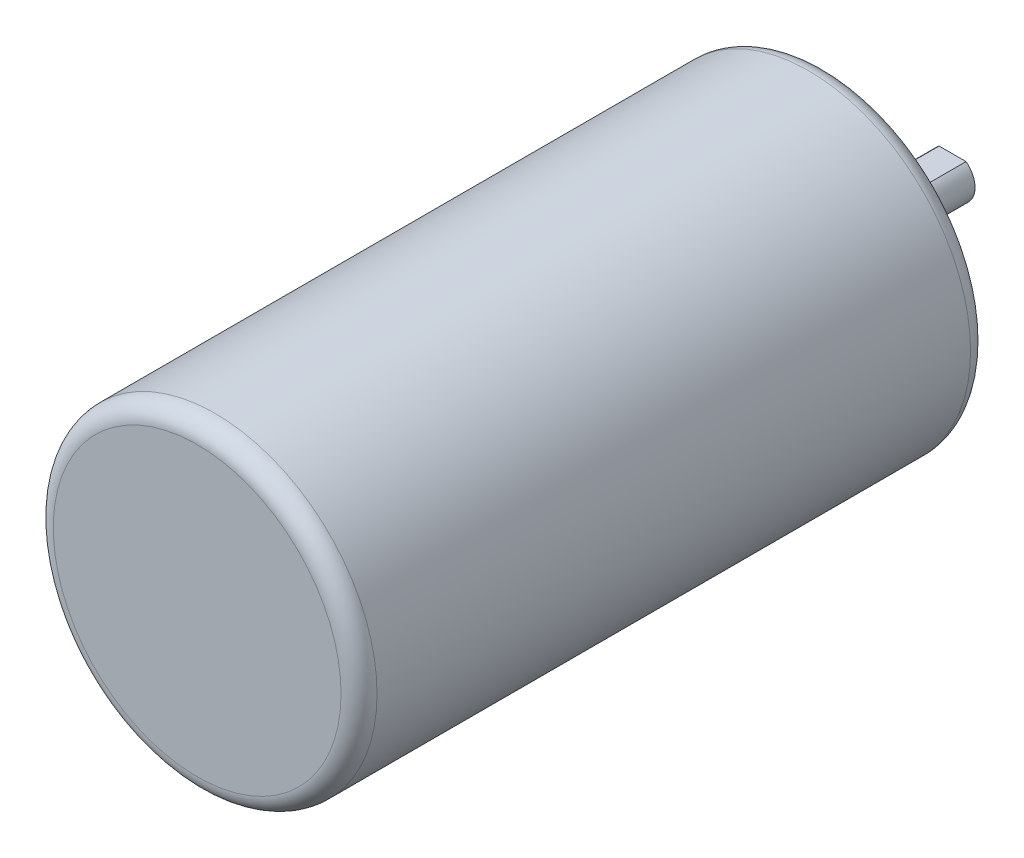
ISO-10303-21;
HEADER;
FILE_DESCRIPTION(('STEP AP214'),'2;1');
FILE_NAME('part.step','',(''),(''),'','','');
FILE_SCHEMA(('AUTOMOTIVE_DESIGN { 1 0 10303 214 1 1 1 1 }'));
ENDSEC;
DATA;
#1=APPLICATION_CONTEXT('core data for automotive mechanical design processes');
#2=APPLICATION_PROTOCOL_DEFINITION('international standard','automotive_design',2000,#1);
#3=PRODUCT_CONTEXT('',#1,'mechanical');
#4=PRODUCT('Part','Part','',(#3));
#5=PRODUCT_RELATED_PRODUCT_CATEGORY('part','',(#4));
#6=PRODUCT_DEFINITION_FORMATION('','',#4);
#7=PRODUCT_DEFINITION_CONTEXT('part definition',#1,'design');
#8=PRODUCT_DEFINITION('design','',#6,#7);
#9=PRODUCT_DEFINITION_SHAPE('','',#8);
#10=(LENGTH_UNIT() NAMED_UNIT(*) SI_UNIT(.MILLI.,.METRE.));
#11=(NAMED_UNIT(*) PLANE_ANGLE_UNIT() SI_UNIT($,.RADIAN.));
#12=(NAMED_UNIT(*) SI_UNIT($,.STERADIAN.) SOLID_ANGLE_UNIT());
#13=UNCERTAINTY_MEASURE_WITH_UNIT(LENGTH_MEASURE(1.E-05),#10,'distance_accuracy_value','');
#14=(GEOMETRIC_REPRESENTATION_CONTEXT(3) GLOBAL_UNCERTAINTY_ASSIGNED_CONTEXT((#13)) GLOBAL_UNIT_ASSIGNED_CONTEXT((#10,
#11,#12)) REPRESENTATION_CONTEXT('',''));
#15=CARTESIAN_POINT('',(0.,0.,0.));
#16=DIRECTION('',(0.,0.,1.));
#17=DIRECTION('',(1.,0.,0.));
#18=AXIS2_PLACEMENT_3D('',#15,#16,#17);
#19=CARTESIAN_POINT('',(0.,0.,0.));
#20=DIRECTION('',(0.,0.,1.));
#21=DIRECTION('',(1.,0.,0.));
#22=AXIS2_PLACEMENT_3D('',#19,#20,#21);
#23=PLANE('',#22);
#24=CARTESIAN_POINT('',(12.5,0.,0.));
#25=DIRECTION('',(0.,0.,-1.));
#26=DIRECTION('',(-1.,0.,0.));
#27=AXIS2_PLACEMENT_3D('',#24,#25,#26);
#28=CIRCLE('',#27,1.5);
#29=CARTESIAN_POINT('',(11.,0.,0.));
#30=VERTEX_POINT('',#29);
#31=EDGE_CURVE('E125',#30,#30,#28,.T.);
#32=ORIENTED_EDGE('',*,*,#31,.F.);
#33=EDGE_LOOP('',(#32));
#34=FACE_BOUND('',#33,.T.);
#35=CARTESIAN_POINT('',(6.25000000000013,-10.8253175473054,0.));
#36=DIRECTION('',(0.,0.,-1.));
#37=DIRECTION('',(-1.,0.,0.));
#38=AXIS2_PLACEMENT_3D('',#35,#36,#37);
#39=CIRCLE('',#38,1.5);
#40=CARTESIAN_POINT('',(4.75000000000013,-10.8253175473054,0.));
#41=VERTEX_POINT('',#40);
#42=EDGE_CURVE('E126',#41,#41,#39,.T.);
#43=ORIENTED_EDGE('',*,*,#42,.F.);
#44=EDGE_LOOP('',(#43));
#45=FACE_BOUND('',#44,.T.);
#46=CARTESIAN_POINT('',(-6.2499999999999,-10.8253175473055,0.));
#47=DIRECTION('',(0.,0.,-1.));
#48=DIRECTION('',(-1.,0.,0.));
#49=AXIS2_PLACEMENT_3D('',#46,#47,#48);
#50=CIRCLE('',#49,1.5);
#51=CARTESIAN_POINT('',(-7.7499999999999,-10.8253175473055,0.));
#52=VERTEX_POINT('',#51);
#53=EDGE_CURVE('E132',#52,#52,#50,.T.);
#54=ORIENTED_EDGE('',*,*,#53,.F.);
#55=EDGE_LOOP('',(#54));
#56=FACE_BOUND('',#55,.T.);
#57=CARTESIAN_POINT('',(-12.5,0.,0.));
#58=DIRECTION('',(0.,0.,-1.));
#59=DIRECTION('',(-1.,0.,0.));
#60=AXIS2_PLACEMENT_3D('',#57,#58,#59);
#61=CIRCLE('',#60,1.5);
#62=CARTESIAN_POINT('',(-14.,0.,0.));
#63=VERTEX_POINT('',#62);
#64=EDGE_CURVE('E138',#63,#63,#61,.T.);
#65=ORIENTED_EDGE('',*,*,#64,.F.);
#66=EDGE_LOOP('',(#65));
#67=FACE_BOUND('',#66,.T.);
#68=CARTESIAN_POINT('',(-6.25000000000005,10.8253175473055,0.));
#69=DIRECTION('',(0.,0.,-1.));
#70=DIRECTION('',(-1.,0.,0.));
#71=AXIS2_PLACEMENT_3D('',#68,#69,#70);
#72=CIRCLE('',#71,1.5);
#73=CARTESIAN_POINT('',(-7.75000000000005,10.8253175473055,0.));
#74=VERTEX_POINT('',#73);
#75=EDGE_CURVE('E136',#74,#74,#72,.T.);
#76=ORIENTED_EDGE('',*,*,#75,.F.);
#77=EDGE_LOOP('',(#76));
#78=FACE_BOUND('',#77,.T.);
#79=CARTESIAN_POINT('',(6.24999999999998,10.8253175473055,0.));
#80=DIRECTION('',(0.,0.,-1.));
#81=DIRECTION('',(-1.,0.,0.));
#82=AXIS2_PLACEMENT_3D('',#79,#80,#81);
#83=CIRCLE('',#82,1.5);
#84=CARTESIAN_POINT('',(4.74999999999998,10.8253175473055,0.));
#85=VERTEX_POINT('',#84);
#86=EDGE_CURVE('E145',#85,#85,#83,.T.);
#87=ORIENTED_EDGE('',*,*,#86,.F.);
#88=EDGE_LOOP('',(#87));
#89=FACE_BOUND('',#88,.T.);
#90=CARTESIAN_POINT('',(0.,0.,0.));
#91=DIRECTION('',(0.,0.,1.));
#92=DIRECTION('',(1.,0.,0.));
#93=AXIS2_PLACEMENT_3D('',#90,#91,#92);
#94=CIRCLE('',#93,16.);
#95=CARTESIAN_POINT('',(16.,0.,0.));
#96=VERTEX_POINT('',#95);
#97=EDGE_CURVE('E11',#96,#96,#94,.F.);
#98=ORIENTED_EDGE('',*,*,#97,.T.);
#99=EDGE_LOOP('',(#98));
#100=FACE_BOUND('',#99,.T.);
#101=CARTESIAN_POINT('',(0.,0.,0.));
#102=DIRECTION('',(0.,0.,-1.));
#103=DIRECTION('',(-1.,0.,0.));
#104=AXIS2_PLACEMENT_3D('',#101,#102,#103);
#105=CIRCLE('',#104,2.5);
#106=CARTESIAN_POINT('',(1.5,2.,0.));
#107=VERTEX_POINT('',#106);
#108=CARTESIAN_POINT('',(-1.5,2.,0.));
#109=VERTEX_POINT('',#108);
#110=EDGE_CURVE('E75',#107,#109,#105,.T.);
#111=ORIENTED_EDGE('',*,*,#110,.F.);
#112=DIRECTION('',(1.,0.,0.));
#113=VECTOR('',#112,1.);
#114=CARTESIAN_POINT('',(1.5,2.,0.));
#115=LINE('',#114,#113);
#116=EDGE_CURVE('E56',#109,#107,#115,.T.);
#117=ORIENTED_EDGE('',*,*,#116,.F.);
#118=EDGE_LOOP('',(#111,#117));
#119=FACE_BOUND('',#118,.T.);
#120=ADVANCED_FACE('F44',(#34,#45,#56,#67,#78,#89,#100,#119),#23,.F.);
#121=CARTESIAN_POINT('',(0.,0.,70.));
#122=DIRECTION('',(0.,0.,-1.));
#123=DIRECTION('',(-1.,0.,0.));
#124=AXIS2_PLACEMENT_3D('',#121,#122,#123);
#125=CYLINDRICAL_SURFACE('',#124,18.);
#126=CARTESIAN_POINT('',(0.,0.,68.));
#127=DIRECTION('',(0.,0.,1.));
#128=DIRECTION('',(1.,0.,0.));
#129=AXIS2_PLACEMENT_3D('',#126,#127,#128);
#130=CIRCLE('',#129,18.);
#131=CARTESIAN_POINT('',(18.,0.,68.));
#132=VERTEX_POINT('',#131);
#133=EDGE_CURVE('E52',#132,#132,#130,.F.);
#134=ORIENTED_EDGE('',*,*,#133,.T.);
#135=EDGE_LOOP('',(#134));
#136=FACE_BOUND('',#135,.T.);
#137=CARTESIAN_POINT('',(0.,0.,2.));
#138=DIRECTION('',(0.,0.,1.));
#139=DIRECTION('',(1.,0.,0.));
#140=AXIS2_PLACEMENT_3D('',#137,#138,#139);
#141=CIRCLE('',#140,18.);
#142=CARTESIAN_POINT('',(18.,0.,2.));
#143=VERTEX_POINT('',#142);
#144=EDGE_CURVE('E91',#143,#143,#141,.T.);
#145=ORIENTED_EDGE('',*,*,#144,.T.);
#146=EDGE_LOOP('',(#145));
#147=FACE_BOUND('',#146,.T.);
#148=ADVANCED_FACE('F98',(#136,#147),#125,.T.);
#149=CARTESIAN_POINT('',(0.,0.,70.));
#150=DIRECTION('',(0.,0.,1.));
#151=DIRECTION('',(1.,0.,0.));
#152=AXIS2_PLACEMENT_3D('',#149,#150,#151);
#153=PLANE('',#152);
#154=CARTESIAN_POINT('',(0.,0.,70.));
#155=DIRECTION('',(0.,0.,1.));
#156=DIRECTION('',(1.,0.,0.));
#157=AXIS2_PLACEMENT_3D('',#154,#155,#156);
#158=CIRCLE('',#157,16.);
#159=CARTESIAN_POINT('',(16.,0.,70.));
#160=VERTEX_POINT('',#159);
#161=EDGE_CURVE('E87',#160,#160,#158,.T.);
#162=ORIENTED_EDGE('',*,*,#161,.T.);
#163=EDGE_LOOP('',(#162));
#164=FACE_BOUND('',#163,.T.);
#165=ADVANCED_FACE('F110',(#164),#153,.T.);
#166=CARTESIAN_POINT('',(0.,0.,-14.));
#167=DIRECTION('',(0.,0.,1.));
#168=DIRECTION('',(1.,0.,0.));
#169=AXIS2_PLACEMENT_3D('',#166,#167,#168);
#170=CYLINDRICAL_SURFACE('',#169,2.5);
#171=ORIENTED_EDGE('',*,*,#110,.T.);
#172=DIRECTION('',(0.,0.,1.));
#173=VECTOR('',#172,1.);
#174=CARTESIAN_POINT('',(-1.5,2.,-14.));
#175=LINE('',#174,#173);
#176=CARTESIAN_POINT('',(-1.5,2.,-14.));
#177=VERTEX_POINT('',#176);
#178=EDGE_CURVE('E84',#177,#109,#175,.T.);
#179=ORIENTED_EDGE('',*,*,#178,.F.);
#180=CARTESIAN_POINT('',(0.,0.,-14.));
#181=DIRECTION('',(0.,0.,-1.));
#182=DIRECTION('',(-1.,0.,0.));
#183=AXIS2_PLACEMENT_3D('',#180,#181,#182);
#184=CIRCLE('',#183,2.5);
#185=CARTESIAN_POINT('',(1.5,2.,-14.));
#186=VERTEX_POINT('',#185);
#187=EDGE_CURVE('E82',#186,#177,#184,.T.);
#188=ORIENTED_EDGE('',*,*,#187,.F.);
#189=DIRECTION('',(0.,0.,1.));
#190=VECTOR('',#189,1.);
#191=CARTESIAN_POINT('',(1.5,2.,-14.));
#192=LINE('',#191,#190);
#193=EDGE_CURVE('E80',#186,#107,#192,.T.);
#194=ORIENTED_EDGE('',*,*,#193,.T.);
#195=EDGE_LOOP('',(#171,#179,#188,#194));
#196=FACE_BOUND('',#195,.T.);
#197=ADVANCED_FACE('F81',(#196),#170,.T.);
#198=CARTESIAN_POINT('',(1.5,2.,-14.));
#199=DIRECTION('',(0.,-1.,0.));
#200=DIRECTION('',(0.,0.,-1.));
#201=AXIS2_PLACEMENT_3D('',#198,#199,#200);
#202=PLANE('',#201);
#203=ORIENTED_EDGE('',*,*,#116,.T.);
#204=ORIENTED_EDGE('',*,*,#193,.F.);
#205=DIRECTION('',(1.,0.,0.));
#206=VECTOR('',#205,1.);
#207=CARTESIAN_POINT('',(1.5,2.,-14.));
#208=LINE('',#207,#206);
#209=EDGE_CURVE('E69',#177,#186,#208,.T.);
#210=ORIENTED_EDGE('',*,*,#209,.F.);
#211=ORIENTED_EDGE('',*,*,#178,.T.);
#212=EDGE_LOOP('',(#203,#204,#210,#211));
#213=FACE_BOUND('',#212,.T.);
#214=ADVANCED_FACE('F78',(#213),#202,.F.);
#215=CARTESIAN_POINT('',(0.,0.,-14.));
#216=DIRECTION('',(0.,0.,-1.));
#217=DIRECTION('',(-1.,0.,0.));
#218=AXIS2_PLACEMENT_3D('',#215,#216,#217);
#219=PLANE('',#218);
#220=ORIENTED_EDGE('',*,*,#187,.T.);
#221=ORIENTED_EDGE('',*,*,#209,.T.);
#222=EDGE_LOOP('',(#220,#221));
#223=FACE_BOUND('',#222,.T.);
#224=ADVANCED_FACE('F102',(#223),#219,.T.);
#225=CARTESIAN_POINT('',(0.,0.,68.));
#226=DIRECTION('',(0.,0.,1.));
#227=DIRECTION('',(1.,0.,0.));
#228=AXIS2_PLACEMENT_3D('',#225,#226,#227);
#229=TOROIDAL_SURFACE('',#228,16.,2.);
#230=ORIENTED_EDGE('',*,*,#133,.F.);
#231=EDGE_LOOP('',(#230));
#232=FACE_BOUND('',#231,.T.);
#233=ORIENTED_EDGE('',*,*,#161,.F.);
#234=EDGE_LOOP('',(#233));
#235=FACE_BOUND('',#234,.T.);
#236=ADVANCED_FACE('F101',(#232,#235),#229,.T.);
#237=CARTESIAN_POINT('',(0.,0.,2.));
#238=DIRECTION('',(0.,0.,1.));
#239=DIRECTION('',(1.,0.,0.));
#240=AXIS2_PLACEMENT_3D('',#237,#238,#239);
#241=TOROIDAL_SURFACE('',#240,16.,2.);
#242=ORIENTED_EDGE('',*,*,#97,.F.);
#243=EDGE_LOOP('',(#242));
#244=FACE_BOUND('',#243,.T.);
#245=ORIENTED_EDGE('',*,*,#144,.F.);
#246=EDGE_LOOP('',(#245));
#247=FACE_BOUND('',#246,.T.);
#248=ADVANCED_FACE('F50',(#244,#247),#241,.T.);
#249=CARTESIAN_POINT('',(6.24999999999998,10.8253175473055,10.));
#250=DIRECTION('',(0.,0.,-1.));
#251=DIRECTION('',(-1.,0.,0.));
#252=AXIS2_PLACEMENT_3D('',#249,#250,#251);
#253=CYLINDRICAL_SURFACE('',#252,1.5);
#254=CARTESIAN_POINT('',(6.24999999999998,10.8253175473055,10.));
#255=DIRECTION('',(0.,0.,-1.));
#256=DIRECTION('',(-1.,0.,0.));
#257=AXIS2_PLACEMENT_3D('',#254,#255,#256);
#258=CIRCLE('',#257,1.5);
#259=CARTESIAN_POINT('',(4.74999999999998,10.8253175473055,10.));
#260=VERTEX_POINT('',#259);
#261=EDGE_CURVE('E375',#260,#260,#258,.T.);
#262=ORIENTED_EDGE('',*,*,#261,.F.);
#263=EDGE_LOOP('',(#262));
#264=FACE_BOUND('',#263,.T.);
#265=ORIENTED_EDGE('',*,*,#86,.T.);
#266=EDGE_LOOP('',(#265));
#267=FACE_BOUND('',#266,.T.);
#268=ADVANCED_FACE('F149',(#264,#267),#253,.F.);
#269=CARTESIAN_POINT('',(6.24999999999998,10.8253175473055,10.));
#270=DIRECTION('',(0.,0.,-1.));
#271=DIRECTION('',(-1.,0.,0.));
#272=AXIS2_PLACEMENT_3D('',#269,#270,#271);
#273=PLANE('',#272);
#274=ORIENTED_EDGE('',*,*,#261,.T.);
#275=EDGE_LOOP('',(#274));
#276=FACE_BOUND('',#275,.T.);
#277=ADVANCED_FACE('F152',(#276),#273,.T.);
#278=CARTESIAN_POINT('',(-6.25000000000005,10.8253175473055,10.));
#279=DIRECTION('',(0.,0.,-1.));
#280=DIRECTION('',(-1.,0.,0.));
#281=AXIS2_PLACEMENT_3D('',#278,#279,#280);
#282=CYLINDRICAL_SURFACE('',#281,1.5);
#283=CARTESIAN_POINT('',(-6.25000000000005,10.8253175473055,10.));
#284=DIRECTION('',(0.,0.,-1.));
#285=DIRECTION('',(-1.,0.,0.));
#286=AXIS2_PLACEMENT_3D('',#283,#284,#285);
#287=CIRCLE('',#286,1.5);
#288=CARTESIAN_POINT('',(-7.75000000000005,10.8253175473055,10.));
#289=VERTEX_POINT('',#288);
#290=EDGE_CURVE('E376',#289,#289,#287,.T.);
#291=ORIENTED_EDGE('',*,*,#290,.F.);
#292=EDGE_LOOP('',(#291));
#293=FACE_BOUND('',#292,.T.);
#294=ORIENTED_EDGE('',*,*,#75,.T.);
#295=EDGE_LOOP('',(#294));
#296=FACE_BOUND('',#295,.T.);
#297=ADVANCED_FACE('F161',(#293,#296),#282,.F.);
#298=CARTESIAN_POINT('',(-6.25000000000005,10.8253175473055,10.));
#299=DIRECTION('',(0.,0.,-1.));
#300=DIRECTION('',(-1.,0.,0.));
#301=AXIS2_PLACEMENT_3D('',#298,#299,#300);
#302=PLANE('',#301);
#303=ORIENTED_EDGE('',*,*,#290,.T.);
#304=EDGE_LOOP('',(#303));
#305=FACE_BOUND('',#304,.T.);
#306=ADVANCED_FACE('F172',(#305),#302,.T.);
#307=CARTESIAN_POINT('',(-12.5,0.,10.));
#308=DIRECTION('',(0.,0.,-1.));
#309=DIRECTION('',(-1.,0.,0.));
#310=AXIS2_PLACEMENT_3D('',#307,#308,#309);
#311=CYLINDRICAL_SURFACE('',#310,1.5);
#312=CARTESIAN_POINT('',(-12.5,0.,10.));
#313=DIRECTION('',(0.,0.,-1.));
#314=DIRECTION('',(-1.,0.,0.));
#315=AXIS2_PLACEMENT_3D('',#312,#313,#314);
#316=CIRCLE('',#315,1.5);
#317=CARTESIAN_POINT('',(-14.,0.,10.));
#318=VERTEX_POINT('',#317);
#319=EDGE_CURVE('E379',#318,#318,#316,.T.);
#320=ORIENTED_EDGE('',*,*,#319,.F.);
#321=EDGE_LOOP('',(#320));
#322=FACE_BOUND('',#321,.T.);
#323=ORIENTED_EDGE('',*,*,#64,.T.);
#324=EDGE_LOOP('',(#323));
#325=FACE_BOUND('',#324,.T.);
#326=ADVANCED_FACE('F178',(#322,#325),#311,.F.);
#327=CARTESIAN_POINT('',(-12.5,0.,10.));
#328=DIRECTION('',(0.,0.,-1.));
#329=DIRECTION('',(-1.,0.,0.));
#330=AXIS2_PLACEMENT_3D('',#327,#328,#329);
#331=PLANE('',#330);
#332=ORIENTED_EDGE('',*,*,#319,.T.);
#333=EDGE_LOOP('',(#332));
#334=FACE_BOUND('',#333,.T.);
#335=ADVANCED_FACE('F176',(#334),#331,.T.);
#336=CARTESIAN_POINT('',(-6.2499999999999,-10.8253175473055,10.));
#337=DIRECTION('',(0.,0.,-1.));
#338=DIRECTION('',(-1.,0.,0.));
#339=AXIS2_PLACEMENT_3D('',#336,#337,#338);
#340=CYLINDRICAL_SURFACE('',#339,1.5);
#341=CARTESIAN_POINT('',(-6.2499999999999,-10.8253175473055,10.));
#342=DIRECTION('',(0.,0.,-1.));
#343=DIRECTION('',(-1.,0.,0.));
#344=AXIS2_PLACEMENT_3D('',#341,#342,#343);
#345=CIRCLE('',#344,1.5);
#346=CARTESIAN_POINT('',(-7.7499999999999,-10.8253175473055,10.));
#347=VERTEX_POINT('',#346);
#348=EDGE_CURVE('E370',#347,#347,#345,.T.);
#349=ORIENTED_EDGE('',*,*,#348,.F.);
#350=EDGE_LOOP('',(#349));
#351=FACE_BOUND('',#350,.T.);
#352=ORIENTED_EDGE('',*,*,#53,.T.);
#353=EDGE_LOOP('',(#352));
#354=FACE_BOUND('',#353,.T.);
#355=ADVANCED_FACE('F184',(#351,#354),#340,.F.);
#356=CARTESIAN_POINT('',(-6.2499999999999,-10.8253175473055,10.));
#357=DIRECTION('',(0.,0.,-1.));
#358=DIRECTION('',(-1.,0.,0.));
#359=AXIS2_PLACEMENT_3D('',#356,#357,#358);
#360=PLANE('',#359);
#361=ORIENTED_EDGE('',*,*,#348,.T.);
#362=EDGE_LOOP('',(#361));
#363=FACE_BOUND('',#362,.T.);
#364=ADVANCED_FACE('F189',(#363),#360,.T.);
#365=CARTESIAN_POINT('',(6.25000000000013,-10.8253175473054,10.));
#366=DIRECTION('',(0.,0.,-1.));
#367=DIRECTION('',(-1.,0.,0.));
#368=AXIS2_PLACEMENT_3D('',#365,#366,#367);
#369=CYLINDRICAL_SURFACE('',#368,1.5);
#370=CARTESIAN_POINT('',(6.25000000000013,-10.8253175473054,10.));
#371=DIRECTION('',(0.,0.,-1.));
#372=DIRECTION('',(-1.,0.,0.));
#373=AXIS2_PLACEMENT_3D('',#370,#371,#372);
#374=CIRCLE('',#373,1.5);
#375=CARTESIAN_POINT('',(4.75000000000013,-10.8253175473054,10.));
#376=VERTEX_POINT('',#375);
#377=EDGE_CURVE('E366',#376,#376,#374,.T.);
#378=ORIENTED_EDGE('',*,*,#377,.F.);
#379=EDGE_LOOP('',(#378));
#380=FACE_BOUND('',#379,.T.);
#381=ORIENTED_EDGE('',*,*,#42,.T.);
#382=EDGE_LOOP('',(#381));
#383=FACE_BOUND('',#382,.T.);
#384=ADVANCED_FACE('F194',(#380,#383),#369,.F.);
#385=CARTESIAN_POINT('',(6.25000000000013,-10.8253175473054,10.));
#386=DIRECTION('',(0.,0.,-1.));
#387=DIRECTION('',(-1.,0.,0.));
#388=AXIS2_PLACEMENT_3D('',#385,#386,#387);
#389=PLANE('',#388);
#390=ORIENTED_EDGE('',*,*,#377,.T.);
#391=EDGE_LOOP('',(#390));
#392=FACE_BOUND('',#391,.T.);
#393=ADVANCED_FACE('F170',(#392),#389,.T.);
#394=CARTESIAN_POINT('',(12.5,0.,10.));
#395=DIRECTION('',(0.,0.,-1.));
#396=DIRECTION('',(-1.,0.,0.));
#397=AXIS2_PLACEMENT_3D('',#394,#395,#396);
#398=CYLINDRICAL_SURFACE('',#397,1.5);
#399=CARTESIAN_POINT('',(12.5,0.,10.));
#400=DIRECTION('',(0.,0.,-1.));
#401=DIRECTION('',(-1.,0.,0.));
#402=AXIS2_PLACEMENT_3D('',#399,#400,#401);
#403=CIRCLE('',#402,1.5);
#404=CARTESIAN_POINT('',(11.,0.,10.));
#405=VERTEX_POINT('',#404);
#406=EDGE_CURVE('E76',#405,#405,#403,.T.);
#407=ORIENTED_EDGE('',*,*,#406,.F.);
#408=EDGE_LOOP('',(#407));
#409=FACE_BOUND('',#408,.T.);
#410=ORIENTED_EDGE('',*,*,#31,.T.);
#411=EDGE_LOOP('',(#410));
#412=FACE_BOUND('',#411,.T.);
#413=ADVANCED_FACE('F329',(#409,#412),#398,.F.);
#414=CARTESIAN_POINT('',(12.5,0.,10.));
#415=DIRECTION('',(0.,0.,-1.));
#416=DIRECTION('',(-1.,0.,0.));
#417=AXIS2_PLACEMENT_3D('',#414,#415,#416);
#418=PLANE('',#417);
#419=ORIENTED_EDGE('',*,*,#406,.T.);
#420=EDGE_LOOP('',(#419));
#421=FACE_BOUND('',#420,.T.);
#422=ADVANCED_FACE('F339',(#421),#418,.T.);
#423=CLOSED_SHELL('',(#120,#148,#165,#197,#214,#224,#236,#248,#268,#277,#297,#306,#326,#335,
#355,#364,#384,#393,#413,#422));
#424=MANIFOLD_SOLID_BREP('B2',#423);
#425=ADVANCED_BREP_SHAPE_REPRESENTATION('',(#18,#424),#14);
#426=SHAPE_DEFINITION_REPRESENTATION(#9,#425);
ENDSEC;
END-ISO-10303-21;
